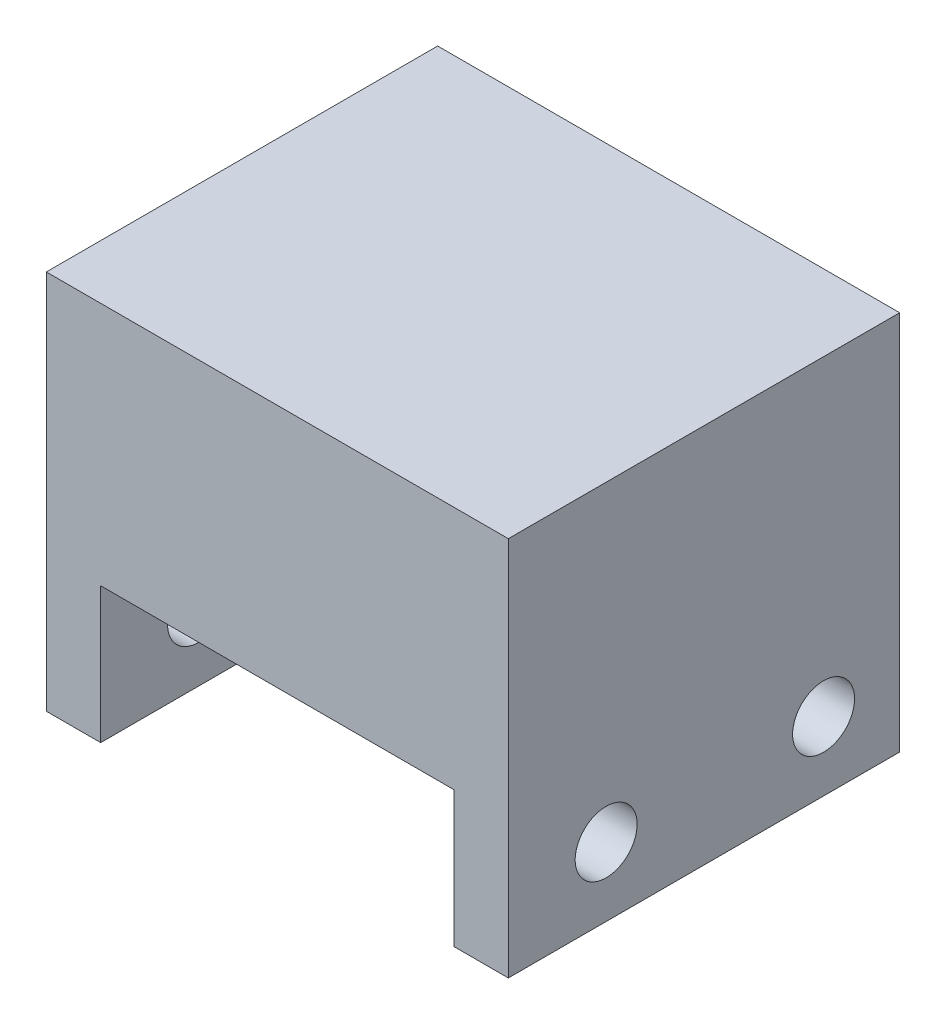
ISO-10303-21;
HEADER;
FILE_DESCRIPTION(('STEP AP214'),'2;1');
FILE_NAME('part.step','',(''),(''),'','','');
FILE_SCHEMA(('AUTOMOTIVE_DESIGN { 1 0 10303 214 1 1 1 1 }'));
ENDSEC;
DATA;
#1=APPLICATION_CONTEXT('core data for automotive mechanical design processes');
#2=APPLICATION_PROTOCOL_DEFINITION('international standard','automotive_design',2000,#1);
#3=PRODUCT_CONTEXT('',#1,'mechanical');
#4=PRODUCT('Part','Part','',(#3));
#5=PRODUCT_RELATED_PRODUCT_CATEGORY('part','',(#4));
#6=PRODUCT_DEFINITION_FORMATION('','',#4);
#7=PRODUCT_DEFINITION_CONTEXT('part definition',#1,'design');
#8=PRODUCT_DEFINITION('design','',#6,#7);
#9=PRODUCT_DEFINITION_SHAPE('','',#8);
#10=(LENGTH_UNIT() NAMED_UNIT(*) SI_UNIT(.MILLI.,.METRE.));
#11=(NAMED_UNIT(*) PLANE_ANGLE_UNIT() SI_UNIT($,.RADIAN.));
#12=(NAMED_UNIT(*) SI_UNIT($,.STERADIAN.) SOLID_ANGLE_UNIT());
#13=UNCERTAINTY_MEASURE_WITH_UNIT(LENGTH_MEASURE(1.E-05),#10,'distance_accuracy_value','');
#14=(GEOMETRIC_REPRESENTATION_CONTEXT(3) GLOBAL_UNCERTAINTY_ASSIGNED_CONTEXT((#13)) GLOBAL_UNIT_ASSIGNED_CONTEXT((#10,
#11,#12)) REPRESENTATION_CONTEXT('',''));
#15=CARTESIAN_POINT('',(0.,0.,0.));
#16=DIRECTION('',(0.,0.,1.));
#17=DIRECTION('',(1.,0.,0.));
#18=AXIS2_PLACEMENT_3D('',#15,#16,#17);
#19=CARTESIAN_POINT('',(0.,25.,0.));
#20=DIRECTION('',(0.,-1.,0.));
#21=DIRECTION('',(0.,0.,-1.));
#22=AXIS2_PLACEMENT_3D('',#19,#20,#21);
#23=PLANE('',#22);
#24=DIRECTION('',(0.,0.,1.));
#25=VECTOR('',#24,1.);
#26=CARTESIAN_POINT('',(-102.936170212766,25.,-52.1382978723404));
#27=LINE('',#26,#25);
#28=CARTESIAN_POINT('',(-102.936170212766,25.,9.86170212765962));
#29=VERTEX_POINT('',#28);
#30=CARTESIAN_POINT('',(-102.936170212766,25.,19.8617021276596));
#31=VERTEX_POINT('',#30);
#32=EDGE_CURVE('E186',#29,#31,#27,.T.);
#33=ORIENTED_EDGE('',*,*,#32,.F.);
#34=DIRECTION('',(1.,0.,0.));
#35=VECTOR('',#34,1.);
#36=CARTESIAN_POINT('',(0.,25.,9.8617021276596));
#37=LINE('',#36,#35);
#38=CARTESIAN_POINT('',(-37.9361702127659,25.,9.86170212765961));
#39=VERTEX_POINT('',#38);
#40=EDGE_CURVE('E145',#29,#39,#37,.T.);
#41=ORIENTED_EDGE('',*,*,#40,.T.);
#42=DIRECTION('',(0.,0.,1.));
#43=VECTOR('',#42,1.);
#44=CARTESIAN_POINT('',(-37.9361702127659,25.,-52.1382978723404));
#45=LINE('',#44,#43);
#46=CARTESIAN_POINT('',(-37.9361702127659,25.,19.8617021276596));
#47=VERTEX_POINT('',#46);
#48=EDGE_CURVE('E179',#39,#47,#45,.T.);
#49=ORIENTED_EDGE('',*,*,#48,.T.);
#50=DIRECTION('',(1.,0.,0.));
#51=VECTOR('',#50,1.);
#52=CARTESIAN_POINT('',(-102.936170212766,25.,19.8617021276596));
#53=LINE('',#52,#51);
#54=EDGE_CURVE('E176',#31,#47,#53,.T.);
#55=ORIENTED_EDGE('',*,*,#54,.F.);
#56=EDGE_LOOP('',(#33,#41,#49,#55));
#57=FACE_BOUND('',#56,.T.);
#58=ADVANCED_FACE('F32',(#57),#23,.T.);
#59=CARTESIAN_POINT('',(0.,0.,0.));
#60=DIRECTION('',(0.,-1.,0.));
#61=DIRECTION('',(0.,0.,-1.));
#62=AXIS2_PLACEMENT_3D('',#59,#60,#61);
#63=PLANE('',#62);
#64=DIRECTION('',(-1.,0.,0.));
#65=VECTOR('',#64,1.);
#66=CARTESIAN_POINT('',(-27.9361702127659,0.,-52.1382978723404));
#67=LINE('',#66,#65);
#68=CARTESIAN_POINT('',(-102.936170212766,0.,-52.1382978723404));
#69=VERTEX_POINT('',#68);
#70=CARTESIAN_POINT('',(-112.936170212766,0.,-52.1382978723404));
#71=VERTEX_POINT('',#70);
#72=EDGE_CURVE('E215',#69,#71,#67,.T.);
#73=ORIENTED_EDGE('',*,*,#72,.F.);
#74=DIRECTION('',(0.,0.,1.));
#75=VECTOR('',#74,1.);
#76=CARTESIAN_POINT('',(-102.936170212766,0.,-52.1382978723404));
#77=LINE('',#76,#75);
#78=CARTESIAN_POINT('',(-102.936170212766,0.,19.8617021276596));
#79=VERTEX_POINT('',#78);
#80=EDGE_CURVE('E180',#69,#79,#77,.T.);
#81=ORIENTED_EDGE('',*,*,#80,.T.);
#82=DIRECTION('',(1.,0.,0.));
#83=VECTOR('',#82,1.);
#84=CARTESIAN_POINT('',(-27.9361702127659,0.,19.8617021276596));
#85=LINE('',#84,#83);
#86=CARTESIAN_POINT('',(-112.936170212766,0.,19.8617021276596));
#87=VERTEX_POINT('',#86);
#88=EDGE_CURVE('E206',#87,#79,#85,.T.);
#89=ORIENTED_EDGE('',*,*,#88,.F.);
#90=DIRECTION('',(0.,0.,1.));
#91=VECTOR('',#90,1.);
#92=CARTESIAN_POINT('',(-112.936170212766,0.,-52.1382978723404));
#93=LINE('',#92,#91);
#94=EDGE_CURVE('E219',#71,#87,#93,.T.);
#95=ORIENTED_EDGE('',*,*,#94,.F.);
#96=EDGE_LOOP('',(#73,#81,#89,#95));
#97=FACE_BOUND('',#96,.T.);
#98=ADVANCED_FACE('F251',(#97),#63,.T.);
#99=CARTESIAN_POINT('',(-27.9361702127659,70.,-52.1382978723404));
#100=DIRECTION('',(-1.,0.,0.));
#101=DIRECTION('',(0.,0.,1.));
#102=AXIS2_PLACEMENT_3D('',#99,#100,#101);
#103=PLANE('',#102);
#104=CARTESIAN_POINT('',(-27.9361702127659,12.6656224620029,1.86170212765961));
#105=DIRECTION('',(1.,0.,0.));
#106=DIRECTION('',(0.,0.,-1.));
#107=AXIS2_PLACEMENT_3D('',#104,#105,#106);
#108=CIRCLE('',#107,5.7);
#109=CARTESIAN_POINT('',(-27.9361702127659,12.6656224620029,-3.83829787234039));
#110=VERTEX_POINT('',#109);
#111=EDGE_CURVE('E161',#110,#110,#108,.T.);
#112=ORIENTED_EDGE('',*,*,#111,.F.);
#113=EDGE_LOOP('',(#112));
#114=FACE_BOUND('',#113,.T.);
#115=CARTESIAN_POINT('',(-27.9361702127659,12.6656224620029,-38.1382978723404));
#116=DIRECTION('',(1.,0.,0.));
#117=DIRECTION('',(0.,0.,-1.));
#118=AXIS2_PLACEMENT_3D('',#115,#116,#117);
#119=CIRCLE('',#118,5.7);
#120=CARTESIAN_POINT('',(-27.9361702127659,12.6656224620029,-43.8382978723404));
#121=VERTEX_POINT('',#120);
#122=EDGE_CURVE('E129',#121,#121,#119,.T.);
#123=ORIENTED_EDGE('',*,*,#122,.F.);
#124=EDGE_LOOP('',(#123));
#125=FACE_BOUND('',#124,.T.);
#126=DIRECTION('',(0.,0.,-1.));
#127=VECTOR('',#126,1.);
#128=CARTESIAN_POINT('',(-27.9361702127659,0.,-52.1382978723404));
#129=LINE('',#128,#127);
#130=CARTESIAN_POINT('',(-27.9361702127659,0.,19.8617021276596));
#131=VERTEX_POINT('',#130);
#132=CARTESIAN_POINT('',(-27.9361702127659,0.,-52.1382978723404));
#133=VERTEX_POINT('',#132);
#134=EDGE_CURVE('E201',#131,#133,#129,.T.);
#135=ORIENTED_EDGE('',*,*,#134,.T.);
#136=DIRECTION('',(0.,-1.,0.));
#137=VECTOR('',#136,1.);
#138=CARTESIAN_POINT('',(-27.9361702127659,70.,-52.1382978723404));
#139=LINE('',#138,#137);
#140=CARTESIAN_POINT('',(-27.9361702127659,70.,-52.1382978723404));
#141=VERTEX_POINT('',#140);
#142=EDGE_CURVE('E11',#141,#133,#139,.T.);
#143=ORIENTED_EDGE('',*,*,#142,.F.);
#144=DIRECTION('',(0.,0.,-1.));
#145=VECTOR('',#144,1.);
#146=CARTESIAN_POINT('',(-27.9361702127659,70.,-52.1382978723404));
#147=LINE('',#146,#145);
#148=CARTESIAN_POINT('',(-27.9361702127659,70.,19.8617021276596));
#149=VERTEX_POINT('',#148);
#150=EDGE_CURVE('E202',#149,#141,#147,.T.);
#151=ORIENTED_EDGE('',*,*,#150,.F.);
#152=DIRECTION('',(0.,-1.,0.));
#153=VECTOR('',#152,1.);
#154=CARTESIAN_POINT('',(-27.9361702127659,70.,19.8617021276596));
#155=LINE('',#154,#153);
#156=EDGE_CURVE('E212',#149,#131,#155,.T.);
#157=ORIENTED_EDGE('',*,*,#156,.T.);
#158=EDGE_LOOP('',(#135,#143,#151,#157));
#159=FACE_BOUND('',#158,.T.);
#160=ADVANCED_FACE('F34',(#114,#125,#159),#103,.F.);
#161=CARTESIAN_POINT('',(-27.9361702127659,70.,-52.1382978723404));
#162=DIRECTION('',(0.,0.,1.));
#163=DIRECTION('',(1.,0.,0.));
#164=AXIS2_PLACEMENT_3D('',#161,#162,#163);
#165=PLANE('',#164);
#166=CARTESIAN_POINT('',(-37.9361702127659,0.,-52.1382978723404));
#167=VERTEX_POINT('',#166);
#168=EDGE_CURVE('E216',#133,#167,#67,.T.);
#169=ORIENTED_EDGE('',*,*,#168,.T.);
#170=DIRECTION('',(0.,-1.,0.));
#171=VECTOR('',#170,1.);
#172=CARTESIAN_POINT('',(-37.9361702127659,25.,-52.1382978723404));
#173=LINE('',#172,#171);
#174=CARTESIAN_POINT('',(-37.9361702127659,25.,-52.1382978723404));
#175=VERTEX_POINT('',#174);
#176=EDGE_CURVE('E196',#175,#167,#173,.T.);
#177=ORIENTED_EDGE('',*,*,#176,.F.);
#178=DIRECTION('',(1.,0.,0.));
#179=VECTOR('',#178,1.);
#180=CARTESIAN_POINT('',(-102.936170212766,25.,-52.1382978723404));
#181=LINE('',#180,#179);
#182=CARTESIAN_POINT('',(-102.936170212766,25.,-52.1382978723404));
#183=VERTEX_POINT('',#182);
#184=EDGE_CURVE('E183',#183,#175,#181,.T.);
#185=ORIENTED_EDGE('',*,*,#184,.F.);
#186=DIRECTION('',(0.,-1.,0.));
#187=VECTOR('',#186,1.);
#188=CARTESIAN_POINT('',(-102.936170212766,25.,-52.1382978723404));
#189=LINE('',#188,#187);
#190=EDGE_CURVE('E193',#183,#69,#189,.T.);
#191=ORIENTED_EDGE('',*,*,#190,.T.);
#192=ORIENTED_EDGE('',*,*,#72,.T.);
#193=DIRECTION('',(0.,-1.,0.));
#194=VECTOR('',#193,1.);
#195=CARTESIAN_POINT('',(-112.936170212766,70.,-52.1382978723404));
#196=LINE('',#195,#194);
#197=CARTESIAN_POINT('',(-112.936170212766,70.,-52.1382978723404));
#198=VERTEX_POINT('',#197);
#199=EDGE_CURVE('E41',#198,#71,#196,.T.);
#200=ORIENTED_EDGE('',*,*,#199,.F.);
#201=DIRECTION('',(-1.,0.,0.));
#202=VECTOR('',#201,1.);
#203=CARTESIAN_POINT('',(-27.9361702127659,70.,-52.1382978723404));
#204=LINE('',#203,#202);
#205=EDGE_CURVE('E205',#141,#198,#204,.T.);
#206=ORIENTED_EDGE('',*,*,#205,.F.);
#207=ORIENTED_EDGE('',*,*,#142,.T.);
#208=EDGE_LOOP('',(#169,#177,#185,#191,#192,#200,#206,#207));
#209=FACE_BOUND('',#208,.T.);
#210=ADVANCED_FACE('F247',(#209),#165,.F.);
#211=CARTESIAN_POINT('',(-112.936170212766,70.,-52.1382978723404));
#212=DIRECTION('',(1.,0.,0.));
#213=DIRECTION('',(0.,0.,-1.));
#214=AXIS2_PLACEMENT_3D('',#211,#212,#213);
#215=PLANE('',#214);
#216=CARTESIAN_POINT('',(-112.936170212766,12.6656224620029,1.86170212765962));
#217=DIRECTION('',(1.,0.,0.));
#218=DIRECTION('',(0.,0.,-1.));
#219=AXIS2_PLACEMENT_3D('',#216,#217,#218);
#220=CIRCLE('',#219,5.7);
#221=CARTESIAN_POINT('',(-112.936170212766,12.6656224620029,-3.83829787234038));
#222=VERTEX_POINT('',#221);
#223=EDGE_CURVE('E157',#222,#222,#220,.T.);
#224=ORIENTED_EDGE('',*,*,#223,.T.);
#225=EDGE_LOOP('',(#224));
#226=FACE_BOUND('',#225,.T.);
#227=CARTESIAN_POINT('',(-112.936170212766,12.6656224620029,-38.1382978723404));
#228=DIRECTION('',(1.,0.,0.));
#229=DIRECTION('',(0.,0.,-1.));
#230=AXIS2_PLACEMENT_3D('',#227,#228,#229);
#231=CIRCLE('',#230,5.7);
#232=CARTESIAN_POINT('',(-112.936170212766,12.6656224620029,-43.8382978723404));
#233=VERTEX_POINT('',#232);
#234=EDGE_CURVE('E164',#233,#233,#231,.T.);
#235=ORIENTED_EDGE('',*,*,#234,.T.);
#236=EDGE_LOOP('',(#235));
#237=FACE_BOUND('',#236,.T.);
#238=ORIENTED_EDGE('',*,*,#94,.T.);
#239=DIRECTION('',(0.,-1.,0.));
#240=VECTOR('',#239,1.);
#241=CARTESIAN_POINT('',(-112.936170212766,70.,19.8617021276596));
#242=LINE('',#241,#240);
#243=CARTESIAN_POINT('',(-112.936170212766,70.,19.8617021276596));
#244=VERTEX_POINT('',#243);
#245=EDGE_CURVE('E226',#244,#87,#242,.T.);
#246=ORIENTED_EDGE('',*,*,#245,.F.);
#247=DIRECTION('',(0.,0.,1.));
#248=VECTOR('',#247,1.);
#249=CARTESIAN_POINT('',(-112.936170212766,70.,-52.1382978723404));
#250=LINE('',#249,#248);
#251=EDGE_CURVE('E208',#198,#244,#250,.T.);
#252=ORIENTED_EDGE('',*,*,#251,.F.);
#253=ORIENTED_EDGE('',*,*,#199,.T.);
#254=EDGE_LOOP('',(#238,#246,#252,#253));
#255=FACE_BOUND('',#254,.T.);
#256=ADVANCED_FACE('F254',(#226,#237,#255),#215,.F.);
#257=CARTESIAN_POINT('',(-27.9361702127659,70.,19.8617021276596));
#258=DIRECTION('',(0.,0.,-1.));
#259=DIRECTION('',(-1.,0.,0.));
#260=AXIS2_PLACEMENT_3D('',#257,#258,#259);
#261=PLANE('',#260);
#262=ORIENTED_EDGE('',*,*,#54,.T.);
#263=DIRECTION('',(0.,-1.,0.));
#264=VECTOR('',#263,1.);
#265=CARTESIAN_POINT('',(-37.9361702127659,25.,19.8617021276596));
#266=LINE('',#265,#264);
#267=CARTESIAN_POINT('',(-37.9361702127659,0.,19.8617021276596));
#268=VERTEX_POINT('',#267);
#269=EDGE_CURVE('E198',#47,#268,#266,.T.);
#270=ORIENTED_EDGE('',*,*,#269,.T.);
#271=EDGE_CURVE('E221',#268,#131,#85,.T.);
#272=ORIENTED_EDGE('',*,*,#271,.T.);
#273=ORIENTED_EDGE('',*,*,#156,.F.);
#274=DIRECTION('',(1.,0.,0.));
#275=VECTOR('',#274,1.);
#276=CARTESIAN_POINT('',(-27.9361702127659,70.,19.8617021276596));
#277=LINE('',#276,#275);
#278=EDGE_CURVE('E210',#244,#149,#277,.T.);
#279=ORIENTED_EDGE('',*,*,#278,.F.);
#280=ORIENTED_EDGE('',*,*,#245,.T.);
#281=ORIENTED_EDGE('',*,*,#88,.T.);
#282=DIRECTION('',(0.,-1.,0.));
#283=VECTOR('',#282,1.);
#284=CARTESIAN_POINT('',(-102.936170212766,25.,19.8617021276596));
#285=LINE('',#284,#283);
#286=EDGE_CURVE('E57',#31,#79,#285,.T.);
#287=ORIENTED_EDGE('',*,*,#286,.F.);
#288=EDGE_LOOP('',(#262,#270,#272,#273,#279,#280,#281,#287));
#289=FACE_BOUND('',#288,.T.);
#290=ADVANCED_FACE('F258',(#289),#261,.F.);
#291=CARTESIAN_POINT('',(0.,70.,0.));
#292=DIRECTION('',(0.,-1.,0.));
#293=DIRECTION('',(0.,0.,-1.));
#294=AXIS2_PLACEMENT_3D('',#291,#292,#293);
#295=PLANE('',#294);
#296=ORIENTED_EDGE('',*,*,#150,.T.);
#297=ORIENTED_EDGE('',*,*,#205,.T.);
#298=ORIENTED_EDGE('',*,*,#251,.T.);
#299=ORIENTED_EDGE('',*,*,#278,.T.);
#300=EDGE_LOOP('',(#296,#297,#298,#299));
#301=FACE_BOUND('',#300,.T.);
#302=ADVANCED_FACE('F262',(#301),#295,.F.);
#303=DIRECTION('',(0.,0.,1.));
#304=VECTOR('',#303,1.);
#305=CARTESIAN_POINT('',(-37.9361702127659,0.,-52.1382978723404));
#306=LINE('',#305,#304);
#307=EDGE_CURVE('E175',#167,#268,#306,.T.);
#308=ORIENTED_EDGE('',*,*,#307,.F.);
#309=ORIENTED_EDGE('',*,*,#168,.F.);
#310=ORIENTED_EDGE('',*,*,#134,.F.);
#311=ORIENTED_EDGE('',*,*,#271,.F.);
#312=EDGE_LOOP('',(#308,#309,#310,#311));
#313=FACE_BOUND('',#312,.T.);
#314=ADVANCED_FACE('F269',(#313),#63,.T.);
#315=CARTESIAN_POINT('',(-37.9361702127659,25.,-52.1382978723404));
#316=DIRECTION('',(1.,0.,0.));
#317=DIRECTION('',(0.,0.,-1.));
#318=AXIS2_PLACEMENT_3D('',#315,#316,#317);
#319=PLANE('',#318);
#320=CARTESIAN_POINT('',(-37.9361702127659,12.6656224620029,1.86170212765961));
#321=DIRECTION('',(1.,0.,0.));
#322=DIRECTION('',(0.,0.,-1.));
#323=AXIS2_PLACEMENT_3D('',#320,#321,#322);
#324=CIRCLE('',#323,5.7);
#325=CARTESIAN_POINT('',(-37.9361702127659,12.6656224620029,-3.83829787234039));
#326=VERTEX_POINT('',#325);
#327=EDGE_CURVE('E172',#326,#326,#324,.T.);
#328=ORIENTED_EDGE('',*,*,#327,.T.);
#329=EDGE_LOOP('',(#328));
#330=FACE_BOUND('',#329,.T.);
#331=CARTESIAN_POINT('',(-37.9361702127659,12.6656224620029,-38.1382978723404));
#332=DIRECTION('',(1.,0.,0.));
#333=DIRECTION('',(0.,0.,-1.));
#334=AXIS2_PLACEMENT_3D('',#331,#332,#333);
#335=CIRCLE('',#334,5.7);
#336=CARTESIAN_POINT('',(-37.9361702127659,12.6656224620029,-43.8382978723404));
#337=VERTEX_POINT('',#336);
#338=EDGE_CURVE('E169',#337,#337,#335,.T.);
#339=ORIENTED_EDGE('',*,*,#338,.T.);
#340=EDGE_LOOP('',(#339));
#341=FACE_BOUND('',#340,.T.);
#342=ORIENTED_EDGE('',*,*,#307,.T.);
#343=ORIENTED_EDGE('',*,*,#269,.F.);
#344=ORIENTED_EDGE('',*,*,#48,.F.);
#345=DIRECTION('',(0.,-1.,0.));
#346=VECTOR('',#345,1.);
#347=CARTESIAN_POINT('',(-37.9361702127659,70.,9.8617021276596));
#348=LINE('',#347,#346);
#349=CARTESIAN_POINT('',(-37.9361702127659,60.,9.86170212765961));
#350=VERTEX_POINT('',#349);
#351=EDGE_CURVE('E143',#350,#39,#348,.T.);
#352=ORIENTED_EDGE('',*,*,#351,.F.);
#353=DIRECTION('',(0.,0.,-1.));
#354=VECTOR('',#353,1.);
#355=CARTESIAN_POINT('',(-37.9361702127659,60.,0.));
#356=LINE('',#355,#354);
#357=CARTESIAN_POINT('',(-37.9361702127659,60.,-42.1382978723404));
#358=VERTEX_POINT('',#357);
#359=EDGE_CURVE('E136',#350,#358,#356,.T.);
#360=ORIENTED_EDGE('',*,*,#359,.T.);
#361=DIRECTION('',(0.,-1.,0.));
#362=VECTOR('',#361,1.);
#363=CARTESIAN_POINT('',(-37.9361702127659,70.,-42.1382978723404));
#364=LINE('',#363,#362);
#365=CARTESIAN_POINT('',(-37.9361702127659,25.,-42.1382978723404));
#366=VERTEX_POINT('',#365);
#367=EDGE_CURVE('E49',#358,#366,#364,.T.);
#368=ORIENTED_EDGE('',*,*,#367,.T.);
#369=EDGE_CURVE('E181',#175,#366,#45,.T.);
#370=ORIENTED_EDGE('',*,*,#369,.F.);
#371=ORIENTED_EDGE('',*,*,#176,.T.);
#372=EDGE_LOOP('',(#342,#343,#344,#352,#360,#368,#370,#371));
#373=FACE_BOUND('',#372,.T.);
#374=ADVANCED_FACE('F141',(#330,#341,#373),#319,.F.);
#375=CARTESIAN_POINT('',(-102.936170212766,25.,-52.1382978723404));
#376=DIRECTION('',(1.,0.,0.));
#377=DIRECTION('',(0.,0.,-1.));
#378=AXIS2_PLACEMENT_3D('',#375,#376,#377);
#379=PLANE('',#378);
#380=CARTESIAN_POINT('',(-102.936170212766,12.6656224620029,1.86170212765962));
#381=DIRECTION('',(1.,0.,0.));
#382=DIRECTION('',(0.,0.,-1.));
#383=AXIS2_PLACEMENT_3D('',#380,#381,#382);
#384=CIRCLE('',#383,5.7);
#385=CARTESIAN_POINT('',(-102.936170212766,12.6656224620029,-3.83829787234038));
#386=VERTEX_POINT('',#385);
#387=EDGE_CURVE('E36',#386,#386,#384,.T.);
#388=ORIENTED_EDGE('',*,*,#387,.F.);
#389=EDGE_LOOP('',(#388));
#390=FACE_BOUND('',#389,.T.);
#391=CARTESIAN_POINT('',(-102.936170212766,12.6656224620029,-38.1382978723404));
#392=DIRECTION('',(1.,0.,0.));
#393=DIRECTION('',(0.,0.,-1.));
#394=AXIS2_PLACEMENT_3D('',#391,#392,#393);
#395=CIRCLE('',#394,5.7);
#396=CARTESIAN_POINT('',(-102.936170212766,12.6656224620029,-43.8382978723404));
#397=VERTEX_POINT('',#396);
#398=EDGE_CURVE('E160',#397,#397,#395,.T.);
#399=ORIENTED_EDGE('',*,*,#398,.F.);
#400=EDGE_LOOP('',(#399));
#401=FACE_BOUND('',#400,.T.);
#402=ORIENTED_EDGE('',*,*,#80,.F.);
#403=ORIENTED_EDGE('',*,*,#190,.F.);
#404=CARTESIAN_POINT('',(-102.936170212766,25.,-42.1382978723404));
#405=VERTEX_POINT('',#404);
#406=EDGE_CURVE('E187',#183,#405,#27,.T.);
#407=ORIENTED_EDGE('',*,*,#406,.T.);
#408=DIRECTION('',(0.,-1.,0.));
#409=VECTOR('',#408,1.);
#410=CARTESIAN_POINT('',(-102.936170212766,70.,-42.1382978723404));
#411=LINE('',#410,#409);
#412=CARTESIAN_POINT('',(-102.936170212766,60.,-42.1382978723404));
#413=VERTEX_POINT('',#412);
#414=EDGE_CURVE('E130',#413,#405,#411,.T.);
#415=ORIENTED_EDGE('',*,*,#414,.F.);
#416=DIRECTION('',(0.,0.,1.));
#417=VECTOR('',#416,1.);
#418=CARTESIAN_POINT('',(-102.936170212766,60.,0.));
#419=LINE('',#418,#417);
#420=CARTESIAN_POINT('',(-102.936170212766,60.,9.86170212765962));
#421=VERTEX_POINT('',#420);
#422=EDGE_CURVE('E138',#413,#421,#419,.T.);
#423=ORIENTED_EDGE('',*,*,#422,.T.);
#424=DIRECTION('',(0.,-1.,0.));
#425=VECTOR('',#424,1.);
#426=CARTESIAN_POINT('',(-102.936170212766,70.,9.86170212765962));
#427=LINE('',#426,#425);
#428=EDGE_CURVE('E149',#421,#29,#427,.T.);
#429=ORIENTED_EDGE('',*,*,#428,.T.);
#430=ORIENTED_EDGE('',*,*,#32,.T.);
#431=ORIENTED_EDGE('',*,*,#286,.T.);
#432=EDGE_LOOP('',(#402,#403,#407,#415,#423,#429,#430,#431));
#433=FACE_BOUND('',#432,.T.);
#434=ADVANCED_FACE('F236',(#390,#401,#433),#379,.T.);
#435=DIRECTION('',(1.,0.,0.));
#436=VECTOR('',#435,1.);
#437=CARTESIAN_POINT('',(-27.9361702127659,25.,-42.1382978723404));
#438=LINE('',#437,#436);
#439=EDGE_CURVE('E127',#405,#366,#438,.T.);
#440=ORIENTED_EDGE('',*,*,#439,.F.);
#441=ORIENTED_EDGE('',*,*,#406,.F.);
#442=ORIENTED_EDGE('',*,*,#184,.T.);
#443=ORIENTED_EDGE('',*,*,#369,.T.);
#444=EDGE_LOOP('',(#440,#441,#442,#443));
#445=FACE_BOUND('',#444,.T.);
#446=ADVANCED_FACE('F238',(#445),#23,.T.);
#447=CARTESIAN_POINT('',(-112.936170212766,12.6656224620029,-38.1382978723404));
#448=DIRECTION('',(1.,0.,0.));
#449=DIRECTION('',(0.,0.,-1.));
#450=AXIS2_PLACEMENT_3D('',#447,#448,#449);
#451=CYLINDRICAL_SURFACE('',#450,5.7);
#452=ORIENTED_EDGE('',*,*,#398,.T.);
#453=EDGE_LOOP('',(#452));
#454=FACE_BOUND('',#453,.T.);
#455=ORIENTED_EDGE('',*,*,#234,.F.);
#456=EDGE_LOOP('',(#455));
#457=FACE_BOUND('',#456,.T.);
#458=ADVANCED_FACE('F233',(#454,#457),#451,.F.);
#459=CARTESIAN_POINT('',(-112.936170212766,12.6656224620029,1.86170212765962));
#460=DIRECTION('',(1.,0.,0.));
#461=DIRECTION('',(0.,0.,-1.));
#462=AXIS2_PLACEMENT_3D('',#459,#460,#461);
#463=CYLINDRICAL_SURFACE('',#462,5.7);
#464=ORIENTED_EDGE('',*,*,#387,.T.);
#465=EDGE_LOOP('',(#464));
#466=FACE_BOUND('',#465,.T.);
#467=ORIENTED_EDGE('',*,*,#223,.F.);
#468=EDGE_LOOP('',(#467));
#469=FACE_BOUND('',#468,.T.);
#470=ADVANCED_FACE('F283',(#466,#469),#463,.F.);
#471=ORIENTED_EDGE('',*,*,#122,.T.);
#472=EDGE_LOOP('',(#471));
#473=FACE_BOUND('',#472,.T.);
#474=ORIENTED_EDGE('',*,*,#338,.F.);
#475=EDGE_LOOP('',(#474));
#476=FACE_BOUND('',#475,.T.);
#477=ADVANCED_FACE('F285',(#473,#476),#451,.F.);
#478=ORIENTED_EDGE('',*,*,#111,.T.);
#479=EDGE_LOOP('',(#478));
#480=FACE_BOUND('',#479,.T.);
#481=ORIENTED_EDGE('',*,*,#327,.F.);
#482=EDGE_LOOP('',(#481));
#483=FACE_BOUND('',#482,.T.);
#484=ADVANCED_FACE('F342',(#480,#483),#463,.F.);
#485=CARTESIAN_POINT('',(-27.9361702127659,70.,-42.1382978723404));
#486=DIRECTION('',(0.,0.,1.));
#487=DIRECTION('',(1.,0.,0.));
#488=AXIS2_PLACEMENT_3D('',#485,#486,#487);
#489=PLANE('',#488);
#490=ORIENTED_EDGE('',*,*,#367,.F.);
#491=DIRECTION('',(-1.,0.,0.));
#492=VECTOR('',#491,1.);
#493=CARTESIAN_POINT('',(0.,60.,-42.1382978723404));
#494=LINE('',#493,#492);
#495=EDGE_CURVE('E124',#358,#413,#494,.T.);
#496=ORIENTED_EDGE('',*,*,#495,.T.);
#497=ORIENTED_EDGE('',*,*,#414,.T.);
#498=ORIENTED_EDGE('',*,*,#439,.T.);
#499=EDGE_LOOP('',(#490,#496,#497,#498));
#500=FACE_BOUND('',#499,.T.);
#501=ADVANCED_FACE('F123',(#500),#489,.T.);
#502=CARTESIAN_POINT('',(-27.9361702127659,70.,9.86170212765961));
#503=DIRECTION('',(0.,0.,-1.));
#504=DIRECTION('',(-1.,0.,0.));
#505=AXIS2_PLACEMENT_3D('',#502,#503,#504);
#506=PLANE('',#505);
#507=ORIENTED_EDGE('',*,*,#428,.F.);
#508=DIRECTION('',(1.,0.,0.));
#509=VECTOR('',#508,1.);
#510=CARTESIAN_POINT('',(0.,60.,9.8617021276596));
#511=LINE('',#510,#509);
#512=EDGE_CURVE('E150',#421,#350,#511,.T.);
#513=ORIENTED_EDGE('',*,*,#512,.T.);
#514=ORIENTED_EDGE('',*,*,#351,.T.);
#515=ORIENTED_EDGE('',*,*,#40,.F.);
#516=EDGE_LOOP('',(#507,#513,#514,#515));
#517=FACE_BOUND('',#516,.T.);
#518=ADVANCED_FACE('F275',(#517),#506,.T.);
#519=CARTESIAN_POINT('',(0.,60.,0.));
#520=DIRECTION('',(0.,-1.,0.));
#521=DIRECTION('',(0.,0.,-1.));
#522=AXIS2_PLACEMENT_3D('',#519,#520,#521);
#523=PLANE('',#522);
#524=ORIENTED_EDGE('',*,*,#359,.F.);
#525=ORIENTED_EDGE('',*,*,#512,.F.);
#526=ORIENTED_EDGE('',*,*,#422,.F.);
#527=ORIENTED_EDGE('',*,*,#495,.F.);
#528=EDGE_LOOP('',(#524,#525,#526,#527));
#529=FACE_BOUND('',#528,.T.);
#530=ADVANCED_FACE('F134',(#529),#523,.T.);
#531=CLOSED_SHELL('',(#58,#98,#160,#210,#256,#290,#302,#314,#374,#434,#446,#458,#470,#477,#484,
#501,#518,#530));
#532=MANIFOLD_SOLID_BREP('B2',#531);
#533=ADVANCED_BREP_SHAPE_REPRESENTATION('',(#18,#532),#14);
#534=SHAPE_DEFINITION_REPRESENTATION(#9,#533);
ENDSEC;
END-ISO-10303-21;
